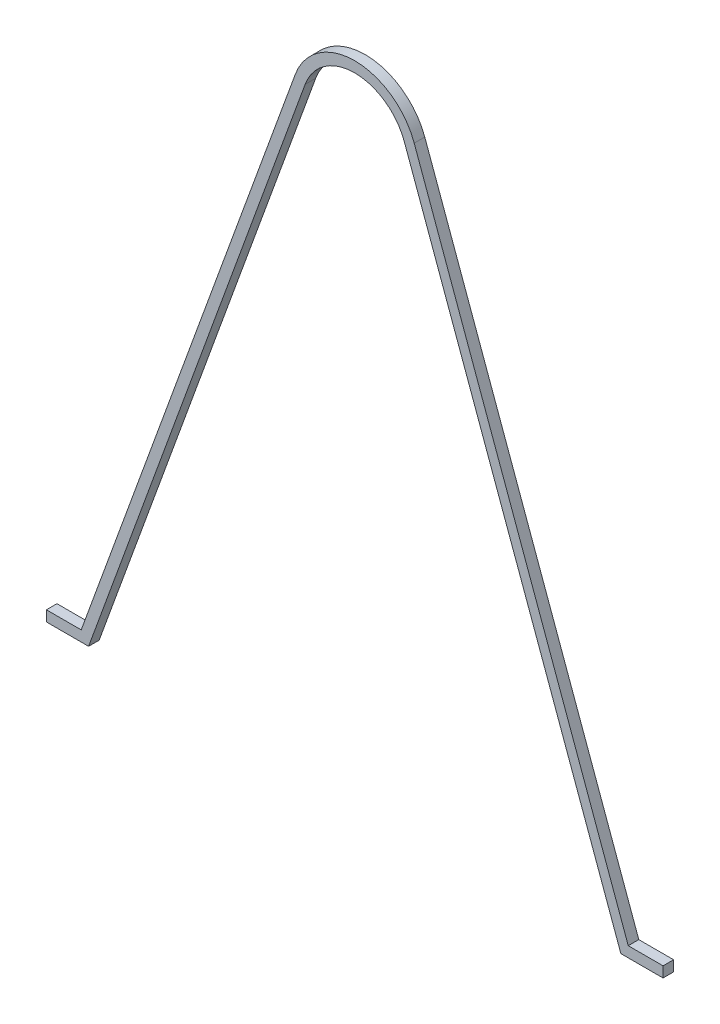
ISO-10303-21;
HEADER;
FILE_DESCRIPTION(('STEP AP214'),'2;1');
FILE_NAME('part.step','',(''),(''),'','','');
FILE_SCHEMA(('AUTOMOTIVE_DESIGN { 1 0 10303 214 1 1 1 1 }'));
ENDSEC;
DATA;
#1=APPLICATION_CONTEXT('core data for automotive mechanical design processes');
#2=APPLICATION_PROTOCOL_DEFINITION('international standard','automotive_design',2000,#1);
#3=PRODUCT_CONTEXT('',#1,'mechanical');
#4=PRODUCT('Part','Part','',(#3));
#5=PRODUCT_RELATED_PRODUCT_CATEGORY('part','',(#4));
#6=PRODUCT_DEFINITION_FORMATION('','',#4);
#7=PRODUCT_DEFINITION_CONTEXT('part definition',#1,'design');
#8=PRODUCT_DEFINITION('design','',#6,#7);
#9=PRODUCT_DEFINITION_SHAPE('','',#8);
#10=(LENGTH_UNIT() NAMED_UNIT(*) SI_UNIT(.MILLI.,.METRE.));
#11=(NAMED_UNIT(*) PLANE_ANGLE_UNIT() SI_UNIT($,.RADIAN.));
#12=(NAMED_UNIT(*) SI_UNIT($,.STERADIAN.) SOLID_ANGLE_UNIT());
#13=UNCERTAINTY_MEASURE_WITH_UNIT(LENGTH_MEASURE(1.E-05),#10,'distance_accuracy_value','');
#14=(GEOMETRIC_REPRESENTATION_CONTEXT(3) GLOBAL_UNCERTAINTY_ASSIGNED_CONTEXT((#13)) GLOBAL_UNIT_ASSIGNED_CONTEXT((#10,
#11,#12)) REPRESENTATION_CONTEXT('',''));
#15=CARTESIAN_POINT('',(0.,0.,0.));
#16=DIRECTION('',(0.,0.,1.));
#17=DIRECTION('',(1.,0.,0.));
#18=AXIS2_PLACEMENT_3D('',#15,#16,#17);
#19=CARTESIAN_POINT('',(-292.196717034695,-536.714565305262,10.));
#20=DIRECTION('',(1.,0.,0.));
#21=DIRECTION('',(0.,0.,-1.));
#22=AXIS2_PLACEMENT_3D('',#19,#20,#21);
#23=PLANE('',#22);
#24=DIRECTION('',(0.,-1.,0.));
#25=VECTOR('',#24,1.);
#26=CARTESIAN_POINT('',(-292.196717034695,-536.714565305262,0.));
#27=LINE('',#26,#25);
#28=CARTESIAN_POINT('',(-292.196717034695,-536.714565305262,0.));
#29=VERTEX_POINT('',#28);
#30=CARTESIAN_POINT('',(-292.196717034695,-546.714565305262,0.));
#31=VERTEX_POINT('',#30);
#32=EDGE_CURVE('E155',#29,#31,#27,.T.);
#33=ORIENTED_EDGE('',*,*,#32,.T.);
#34=DIRECTION('',(0.,0.,-1.));
#35=VECTOR('',#34,1.);
#36=CARTESIAN_POINT('',(-292.196717034695,-546.714565305262,10.));
#37=LINE('',#36,#35);
#38=CARTESIAN_POINT('',(-292.196717034695,-546.714565305262,10.));
#39=VERTEX_POINT('',#38);
#40=EDGE_CURVE('E11',#39,#31,#37,.T.);
#41=ORIENTED_EDGE('',*,*,#40,.F.);
#42=DIRECTION('',(0.,-1.,0.));
#43=VECTOR('',#42,1.);
#44=CARTESIAN_POINT('',(-292.196717034695,-536.714565305262,10.));
#45=LINE('',#44,#43);
#46=CARTESIAN_POINT('',(-292.196717034695,-536.714565305262,10.));
#47=VERTEX_POINT('',#46);
#48=EDGE_CURVE('E177',#47,#39,#45,.T.);
#49=ORIENTED_EDGE('',*,*,#48,.F.);
#50=DIRECTION('',(0.,0.,-1.));
#51=VECTOR('',#50,1.);
#52=CARTESIAN_POINT('',(-292.196717034695,-536.714565305262,10.));
#53=LINE('',#52,#51);
#54=EDGE_CURVE('E151',#47,#29,#53,.T.);
#55=ORIENTED_EDGE('',*,*,#54,.T.);
#56=EDGE_LOOP('',(#33,#41,#49,#55));
#57=FACE_BOUND('',#56,.T.);
#58=ADVANCED_FACE('F35',(#57),#23,.F.);
#59=CARTESIAN_POINT('',(-292.196717034695,-546.714565305262,10.));
#60=DIRECTION('',(0.,1.,0.));
#61=DIRECTION('',(-1.,0.,0.));
#62=AXIS2_PLACEMENT_3D('',#59,#60,#61);
#63=PLANE('',#62);
#64=DIRECTION('',(1.,0.,0.));
#65=VECTOR('',#64,1.);
#66=CARTESIAN_POINT('',(-292.196717034695,-546.714565305262,0.));
#67=LINE('',#66,#65);
#68=CARTESIAN_POINT('',(-252.196717034695,-546.714565305262,0.));
#69=VERTEX_POINT('',#68);
#70=EDGE_CURVE('E158',#31,#69,#67,.T.);
#71=ORIENTED_EDGE('',*,*,#70,.T.);
#72=DIRECTION('',(0.,0.,-1.));
#73=VECTOR('',#72,1.);
#74=CARTESIAN_POINT('',(-252.196717034695,-546.714565305262,10.));
#75=LINE('',#74,#73);
#76=CARTESIAN_POINT('',(-252.196717034695,-546.714565305262,10.));
#77=VERTEX_POINT('',#76);
#78=EDGE_CURVE('E43',#77,#69,#75,.T.);
#79=ORIENTED_EDGE('',*,*,#78,.F.);
#80=DIRECTION('',(1.,0.,0.));
#81=VECTOR('',#80,1.);
#82=CARTESIAN_POINT('',(-292.196717034695,-546.714565305262,10.));
#83=LINE('',#82,#81);
#84=EDGE_CURVE('E106',#39,#77,#83,.T.);
#85=ORIENTED_EDGE('',*,*,#84,.F.);
#86=ORIENTED_EDGE('',*,*,#40,.T.);
#87=EDGE_LOOP('',(#71,#79,#85,#86));
#88=FACE_BOUND('',#87,.T.);
#89=ADVANCED_FACE('F255',(#88),#63,.F.);
#90=CARTESIAN_POINT('',(-252.196717034695,-546.714565305262,10.));
#91=DIRECTION('',(-0.939692620785909,0.342020143325666,0.));
#92=DIRECTION('',(-0.342020143325666,-0.93969262078591,0.));
#93=AXIS2_PLACEMENT_3D('',#90,#91,#92);
#94=PLANE('',#93);
#95=DIRECTION('',(0.342020143325666,0.939692620785909,0.));
#96=VECTOR('',#95,1.);
#97=CARTESIAN_POINT('',(-252.196717034695,-546.714565305262,0.));
#98=LINE('',#97,#96);
#99=CARTESIAN_POINT('',(-46.9846310392954,17.1010071662833,0.));
#100=VERTEX_POINT('',#99);
#101=EDGE_CURVE('E160',#69,#100,#98,.T.);
#102=ORIENTED_EDGE('',*,*,#101,.T.);
#103=DIRECTION('',(0.,0.,-1.));
#104=VECTOR('',#103,1.);
#105=CARTESIAN_POINT('',(-46.9846310392954,17.1010071662833,10.));
#106=LINE('',#105,#104);
#107=CARTESIAN_POINT('',(-46.9846310392954,17.1010071662833,10.));
#108=VERTEX_POINT('',#107);
#109=EDGE_CURVE('E196',#108,#100,#106,.T.);
#110=ORIENTED_EDGE('',*,*,#109,.F.);
#111=DIRECTION('',(0.342020143325666,0.939692620785909,0.));
#112=VECTOR('',#111,1.);
#113=CARTESIAN_POINT('',(-252.196717034695,-546.714565305262,10.));
#114=LINE('',#113,#112);
#115=EDGE_CURVE('E204',#77,#108,#114,.T.);
#116=ORIENTED_EDGE('',*,*,#115,.F.);
#117=ORIENTED_EDGE('',*,*,#78,.T.);
#118=EDGE_LOOP('',(#102,#110,#116,#117));
#119=FACE_BOUND('',#118,.T.);
#120=ADVANCED_FACE('F202',(#119),#94,.F.);
#121=CARTESIAN_POINT('',(0.,0.,10.));
#122=DIRECTION('',(0.,0.,-1.));
#123=DIRECTION('',(-1.,0.,0.));
#124=AXIS2_PLACEMENT_3D('',#121,#122,#123);
#125=CYLINDRICAL_SURFACE('',#124,50.);
#126=CARTESIAN_POINT('',(0.,0.,0.));
#127=DIRECTION('',(0.,0.,-1.));
#128=DIRECTION('',(1.,0.,0.));
#129=AXIS2_PLACEMENT_3D('',#126,#127,#128);
#130=CIRCLE('',#129,50.);
#131=CARTESIAN_POINT('',(46.9846310392954,17.1010071662834,0.));
#132=VERTEX_POINT('',#131);
#133=EDGE_CURVE('E162',#100,#132,#130,.T.);
#134=ORIENTED_EDGE('',*,*,#133,.T.);
#135=DIRECTION('',(0.,0.,-1.));
#136=VECTOR('',#135,1.);
#137=CARTESIAN_POINT('',(46.9846310392954,17.1010071662834,10.));
#138=LINE('',#137,#136);
#139=CARTESIAN_POINT('',(46.9846310392954,17.1010071662834,10.));
#140=VERTEX_POINT('',#139);
#141=EDGE_CURVE('E193',#140,#132,#138,.T.);
#142=ORIENTED_EDGE('',*,*,#141,.F.);
#143=CARTESIAN_POINT('',(0.,0.,10.));
#144=DIRECTION('',(0.,0.,-1.));
#145=DIRECTION('',(1.,0.,0.));
#146=AXIS2_PLACEMENT_3D('',#143,#144,#145);
#147=CIRCLE('',#146,50.);
#148=EDGE_CURVE('E222',#108,#140,#147,.T.);
#149=ORIENTED_EDGE('',*,*,#148,.F.);
#150=ORIENTED_EDGE('',*,*,#109,.T.);
#151=EDGE_LOOP('',(#134,#142,#149,#150));
#152=FACE_BOUND('',#151,.T.);
#153=ADVANCED_FACE('F213',(#152),#125,.F.);
#154=CARTESIAN_POINT('',(252.196717034695,-546.714565305262,10.));
#155=DIRECTION('',(0.93969262078591,0.342020143325666,0.));
#156=DIRECTION('',(-0.342020143325666,0.93969262078591,0.));
#157=AXIS2_PLACEMENT_3D('',#154,#155,#156);
#158=PLANE('',#157);
#159=DIRECTION('',(0.342020143325666,-0.939692620785909,0.));
#160=VECTOR('',#159,1.);
#161=CARTESIAN_POINT('',(252.196717034695,-546.714565305262,0.));
#162=LINE('',#161,#160);
#163=CARTESIAN_POINT('',(252.196717034695,-546.714565305262,0.));
#164=VERTEX_POINT('',#163);
#165=EDGE_CURVE('E164',#132,#164,#162,.T.);
#166=ORIENTED_EDGE('',*,*,#165,.T.);
#167=DIRECTION('',(0.,0.,-1.));
#168=VECTOR('',#167,1.);
#169=CARTESIAN_POINT('',(252.196717034695,-546.714565305262,10.));
#170=LINE('',#169,#168);
#171=CARTESIAN_POINT('',(252.196717034695,-546.714565305262,10.));
#172=VERTEX_POINT('',#171);
#173=EDGE_CURVE('E190',#172,#164,#170,.T.);
#174=ORIENTED_EDGE('',*,*,#173,.F.);
#175=DIRECTION('',(0.342020143325666,-0.939692620785909,0.));
#176=VECTOR('',#175,1.);
#177=CARTESIAN_POINT('',(252.196717034695,-546.714565305262,10.));
#178=LINE('',#177,#176);
#179=EDGE_CURVE('E219',#140,#172,#178,.T.);
#180=ORIENTED_EDGE('',*,*,#179,.F.);
#181=ORIENTED_EDGE('',*,*,#141,.T.);
#182=EDGE_LOOP('',(#166,#174,#180,#181));
#183=FACE_BOUND('',#182,.T.);
#184=ADVANCED_FACE('F217',(#183),#158,.F.);
#185=CARTESIAN_POINT('',(292.196717034695,-546.714565305262,10.));
#186=DIRECTION('',(0.,1.,0.));
#187=DIRECTION('',(-1.,0.,0.));
#188=AXIS2_PLACEMENT_3D('',#185,#186,#187);
#189=PLANE('',#188);
#190=DIRECTION('',(1.,0.,0.));
#191=VECTOR('',#190,1.);
#192=CARTESIAN_POINT('',(292.196717034695,-546.714565305262,0.));
#193=LINE('',#192,#191);
#194=CARTESIAN_POINT('',(292.196717034695,-546.714565305262,0.));
#195=VERTEX_POINT('',#194);
#196=EDGE_CURVE('E166',#164,#195,#193,.T.);
#197=ORIENTED_EDGE('',*,*,#196,.T.);
#198=DIRECTION('',(0.,0.,-1.));
#199=VECTOR('',#198,1.);
#200=CARTESIAN_POINT('',(292.196717034695,-546.714565305262,10.));
#201=LINE('',#200,#199);
#202=CARTESIAN_POINT('',(292.196717034695,-546.714565305262,10.));
#203=VERTEX_POINT('',#202);
#204=EDGE_CURVE('E187',#203,#195,#201,.T.);
#205=ORIENTED_EDGE('',*,*,#204,.F.);
#206=DIRECTION('',(1.,0.,0.));
#207=VECTOR('',#206,1.);
#208=CARTESIAN_POINT('',(292.196717034695,-546.714565305262,10.));
#209=LINE('',#208,#207);
#210=EDGE_CURVE('E221',#172,#203,#209,.T.);
#211=ORIENTED_EDGE('',*,*,#210,.F.);
#212=ORIENTED_EDGE('',*,*,#173,.T.);
#213=EDGE_LOOP('',(#197,#205,#211,#212));
#214=FACE_BOUND('',#213,.T.);
#215=ADVANCED_FACE('F268',(#214),#189,.F.);
#216=CARTESIAN_POINT('',(292.196717034695,-536.714565305262,10.));
#217=DIRECTION('',(-1.,0.,0.));
#218=DIRECTION('',(0.,0.,1.));
#219=AXIS2_PLACEMENT_3D('',#216,#217,#218);
#220=PLANE('',#219);
#221=DIRECTION('',(0.,1.,0.));
#222=VECTOR('',#221,1.);
#223=CARTESIAN_POINT('',(292.196717034695,-536.714565305262,0.));
#224=LINE('',#223,#222);
#225=CARTESIAN_POINT('',(292.196717034695,-536.714565305262,0.));
#226=VERTEX_POINT('',#225);
#227=EDGE_CURVE('E168',#195,#226,#224,.T.);
#228=ORIENTED_EDGE('',*,*,#227,.T.);
#229=DIRECTION('',(0.,0.,-1.));
#230=VECTOR('',#229,1.);
#231=CARTESIAN_POINT('',(292.196717034695,-536.714565305262,10.));
#232=LINE('',#231,#230);
#233=CARTESIAN_POINT('',(292.196717034695,-536.714565305262,10.));
#234=VERTEX_POINT('',#233);
#235=EDGE_CURVE('E184',#234,#226,#232,.T.);
#236=ORIENTED_EDGE('',*,*,#235,.F.);
#237=DIRECTION('',(0.,1.,0.));
#238=VECTOR('',#237,1.);
#239=CARTESIAN_POINT('',(292.196717034695,-536.714565305262,10.));
#240=LINE('',#239,#238);
#241=EDGE_CURVE('E224',#203,#234,#240,.T.);
#242=ORIENTED_EDGE('',*,*,#241,.F.);
#243=ORIENTED_EDGE('',*,*,#204,.T.);
#244=EDGE_LOOP('',(#228,#236,#242,#243));
#245=FACE_BOUND('',#244,.T.);
#246=ADVANCED_FACE('F271',(#245),#220,.F.);
#247=CARTESIAN_POINT('',(292.196717034695,-536.714565305262,10.));
#248=DIRECTION('',(0.,-1.,0.));
#249=DIRECTION('',(0.,0.,-1.));
#250=AXIS2_PLACEMENT_3D('',#247,#248,#249);
#251=PLANE('',#250);
#252=DIRECTION('',(-1.,0.,0.));
#253=VECTOR('',#252,1.);
#254=CARTESIAN_POINT('',(292.196717034695,-536.714565305262,0.));
#255=LINE('',#254,#253);
#256=CARTESIAN_POINT('',(259.198792416792,-536.714565305262,0.));
#257=VERTEX_POINT('',#256);
#258=EDGE_CURVE('E170',#226,#257,#255,.T.);
#259=ORIENTED_EDGE('',*,*,#258,.T.);
#260=DIRECTION('',(0.,0.,-1.));
#261=VECTOR('',#260,1.);
#262=CARTESIAN_POINT('',(259.198792416792,-536.714565305262,10.));
#263=LINE('',#262,#261);
#264=CARTESIAN_POINT('',(259.198792416792,-536.714565305262,10.));
#265=VERTEX_POINT('',#264);
#266=EDGE_CURVE('E181',#265,#257,#263,.T.);
#267=ORIENTED_EDGE('',*,*,#266,.F.);
#268=DIRECTION('',(-1.,0.,0.));
#269=VECTOR('',#268,1.);
#270=CARTESIAN_POINT('',(292.196717034695,-536.714565305262,10.));
#271=LINE('',#270,#269);
#272=EDGE_CURVE('E230',#234,#265,#271,.T.);
#273=ORIENTED_EDGE('',*,*,#272,.F.);
#274=ORIENTED_EDGE('',*,*,#235,.T.);
#275=EDGE_LOOP('',(#259,#267,#273,#274));
#276=FACE_BOUND('',#275,.T.);
#277=ADVANCED_FACE('F236',(#276),#251,.F.);
#278=CARTESIAN_POINT('',(259.198792416792,-536.714565305262,10.));
#279=DIRECTION('',(-0.93969262078591,-0.342020143325666,0.));
#280=DIRECTION('',(0.342020143325666,-0.93969262078591,0.));
#281=AXIS2_PLACEMENT_3D('',#278,#279,#280);
#282=PLANE('',#281);
#283=DIRECTION('',(-0.342020143325666,0.939692620785909,0.));
#284=VECTOR('',#283,1.);
#285=CARTESIAN_POINT('',(259.198792416792,-536.714565305262,0.));
#286=LINE('',#285,#284);
#287=CARTESIAN_POINT('',(56.3815572471546,20.52120859954,0.));
#288=VERTEX_POINT('',#287);
#289=EDGE_CURVE('E172',#257,#288,#286,.T.);
#290=ORIENTED_EDGE('',*,*,#289,.T.);
#291=DIRECTION('',(0.,0.,-1.));
#292=VECTOR('',#291,1.);
#293=CARTESIAN_POINT('',(56.3815572471546,20.52120859954,10.));
#294=LINE('',#293,#292);
#295=CARTESIAN_POINT('',(56.3815572471546,20.52120859954,10.));
#296=VERTEX_POINT('',#295);
#297=EDGE_CURVE('E146',#296,#288,#294,.T.);
#298=ORIENTED_EDGE('',*,*,#297,.F.);
#299=DIRECTION('',(-0.342020143325666,0.939692620785909,0.));
#300=VECTOR('',#299,1.);
#301=CARTESIAN_POINT('',(259.198792416792,-536.714565305262,10.));
#302=LINE('',#301,#300);
#303=EDGE_CURVE('E137',#265,#296,#302,.T.);
#304=ORIENTED_EDGE('',*,*,#303,.F.);
#305=ORIENTED_EDGE('',*,*,#266,.T.);
#306=EDGE_LOOP('',(#290,#298,#304,#305));
#307=FACE_BOUND('',#306,.T.);
#308=ADVANCED_FACE('F240',(#307),#282,.F.);
#309=CARTESIAN_POINT('',(0.,0.,10.));
#310=DIRECTION('',(0.,0.,-1.));
#311=DIRECTION('',(-1.,0.,0.));
#312=AXIS2_PLACEMENT_3D('',#309,#310,#311);
#313=CYLINDRICAL_SURFACE('',#312,60.);
#314=CARTESIAN_POINT('',(0.,0.,0.));
#315=DIRECTION('',(0.,0.,1.));
#316=DIRECTION('',(1.,0.,0.));
#317=AXIS2_PLACEMENT_3D('',#314,#315,#316);
#318=CIRCLE('',#317,60.);
#319=CARTESIAN_POINT('',(-56.3815572471546,20.52120859954,0.));
#320=VERTEX_POINT('',#319);
#321=EDGE_CURVE('E145',#288,#320,#318,.T.);
#322=ORIENTED_EDGE('',*,*,#321,.T.);
#323=DIRECTION('',(0.,0.,-1.));
#324=VECTOR('',#323,1.);
#325=CARTESIAN_POINT('',(-56.3815572471546,20.52120859954,10.));
#326=LINE('',#325,#324);
#327=CARTESIAN_POINT('',(-56.3815572471546,20.52120859954,10.));
#328=VERTEX_POINT('',#327);
#329=EDGE_CURVE('E142',#328,#320,#326,.T.);
#330=ORIENTED_EDGE('',*,*,#329,.F.);
#331=CARTESIAN_POINT('',(0.,0.,10.));
#332=DIRECTION('',(0.,0.,1.));
#333=DIRECTION('',(1.,0.,0.));
#334=AXIS2_PLACEMENT_3D('',#331,#332,#333);
#335=CIRCLE('',#334,60.);
#336=EDGE_CURVE('E131',#296,#328,#335,.T.);
#337=ORIENTED_EDGE('',*,*,#336,.F.);
#338=ORIENTED_EDGE('',*,*,#297,.T.);
#339=EDGE_LOOP('',(#322,#330,#337,#338));
#340=FACE_BOUND('',#339,.T.);
#341=ADVANCED_FACE('F143',(#340),#313,.T.);
#342=CARTESIAN_POINT('',(-259.198792416792,-536.714565305262,10.));
#343=DIRECTION('',(0.939692620785909,-0.342020143325666,0.));
#344=DIRECTION('',(0.342020143325666,0.939692620785909,0.));
#345=AXIS2_PLACEMENT_3D('',#342,#343,#344);
#346=PLANE('',#345);
#347=DIRECTION('',(-0.342020143325666,-0.939692620785909,0.));
#348=VECTOR('',#347,1.);
#349=CARTESIAN_POINT('',(-259.198792416792,-536.714565305262,0.));
#350=LINE('',#349,#348);
#351=CARTESIAN_POINT('',(-259.198792416792,-536.714565305262,0.));
#352=VERTEX_POINT('',#351);
#353=EDGE_CURVE('E92',#320,#352,#350,.T.);
#354=ORIENTED_EDGE('',*,*,#353,.T.);
#355=DIRECTION('',(0.,0.,-1.));
#356=VECTOR('',#355,1.);
#357=CARTESIAN_POINT('',(-259.198792416792,-536.714565305262,10.));
#358=LINE('',#357,#356);
#359=CARTESIAN_POINT('',(-259.198792416792,-536.714565305262,10.));
#360=VERTEX_POINT('',#359);
#361=EDGE_CURVE('E147',#360,#352,#358,.T.);
#362=ORIENTED_EDGE('',*,*,#361,.F.);
#363=DIRECTION('',(-0.342020143325666,-0.939692620785909,0.));
#364=VECTOR('',#363,1.);
#365=CARTESIAN_POINT('',(-259.198792416792,-536.714565305262,10.));
#366=LINE('',#365,#364);
#367=EDGE_CURVE('E135',#328,#360,#366,.T.);
#368=ORIENTED_EDGE('',*,*,#367,.F.);
#369=ORIENTED_EDGE('',*,*,#329,.T.);
#370=EDGE_LOOP('',(#354,#362,#368,#369));
#371=FACE_BOUND('',#370,.T.);
#372=ADVANCED_FACE('F149',(#371),#346,.F.);
#373=CARTESIAN_POINT('',(-292.196717034695,-536.714565305262,10.));
#374=DIRECTION('',(0.,-1.,0.));
#375=DIRECTION('',(0.,0.,-1.));
#376=AXIS2_PLACEMENT_3D('',#373,#374,#375);
#377=PLANE('',#376);
#378=DIRECTION('',(-1.,0.,0.));
#379=VECTOR('',#378,1.);
#380=CARTESIAN_POINT('',(-292.196717034695,-536.714565305262,0.));
#381=LINE('',#380,#379);
#382=EDGE_CURVE('E98',#352,#29,#381,.T.);
#383=ORIENTED_EDGE('',*,*,#382,.T.);
#384=ORIENTED_EDGE('',*,*,#54,.F.);
#385=DIRECTION('',(-1.,0.,0.));
#386=VECTOR('',#385,1.);
#387=CARTESIAN_POINT('',(-292.196717034695,-536.714565305262,10.));
#388=LINE('',#387,#386);
#389=EDGE_CURVE('E51',#360,#47,#388,.T.);
#390=ORIENTED_EDGE('',*,*,#389,.F.);
#391=ORIENTED_EDGE('',*,*,#361,.T.);
#392=EDGE_LOOP('',(#383,#384,#390,#391));
#393=FACE_BOUND('',#392,.T.);
#394=ADVANCED_FACE('F244',(#393),#377,.F.);
#395=CARTESIAN_POINT('',(0.,0.,10.));
#396=DIRECTION('',(0.,0.,1.));
#397=DIRECTION('',(1.,0.,0.));
#398=AXIS2_PLACEMENT_3D('',#395,#396,#397);
#399=PLANE('',#398);
#400=ORIENTED_EDGE('',*,*,#48,.T.);
#401=ORIENTED_EDGE('',*,*,#84,.T.);
#402=ORIENTED_EDGE('',*,*,#115,.T.);
#403=ORIENTED_EDGE('',*,*,#148,.T.);
#404=ORIENTED_EDGE('',*,*,#179,.T.);
#405=ORIENTED_EDGE('',*,*,#210,.T.);
#406=ORIENTED_EDGE('',*,*,#241,.T.);
#407=ORIENTED_EDGE('',*,*,#272,.T.);
#408=ORIENTED_EDGE('',*,*,#303,.T.);
#409=ORIENTED_EDGE('',*,*,#336,.T.);
#410=ORIENTED_EDGE('',*,*,#367,.T.);
#411=ORIENTED_EDGE('',*,*,#389,.T.);
#412=EDGE_LOOP('',(#400,#401,#402,#403,#404,#405,#406,#407,#408,#409,#410,#411));
#413=FACE_BOUND('',#412,.T.);
#414=ADVANCED_FACE('F133',(#413),#399,.T.);
#415=CARTESIAN_POINT('',(0.,0.,0.));
#416=DIRECTION('',(0.,0.,1.));
#417=DIRECTION('',(1.,0.,0.));
#418=AXIS2_PLACEMENT_3D('',#415,#416,#417);
#419=PLANE('',#418);
#420=ORIENTED_EDGE('',*,*,#32,.F.);
#421=ORIENTED_EDGE('',*,*,#382,.F.);
#422=ORIENTED_EDGE('',*,*,#353,.F.);
#423=ORIENTED_EDGE('',*,*,#321,.F.);
#424=ORIENTED_EDGE('',*,*,#289,.F.);
#425=ORIENTED_EDGE('',*,*,#258,.F.);
#426=ORIENTED_EDGE('',*,*,#227,.F.);
#427=ORIENTED_EDGE('',*,*,#196,.F.);
#428=ORIENTED_EDGE('',*,*,#165,.F.);
#429=ORIENTED_EDGE('',*,*,#133,.F.);
#430=ORIENTED_EDGE('',*,*,#101,.F.);
#431=ORIENTED_EDGE('',*,*,#70,.F.);
#432=EDGE_LOOP('',(#420,#421,#422,#423,#424,#425,#426,#427,#428,#429,#430,#431));
#433=FACE_BOUND('',#432,.T.);
#434=ADVANCED_FACE('F208',(#433),#419,.F.);
#435=CLOSED_SHELL('',(#58,#89,#120,#153,#184,#215,#246,#277,#308,#341,#372,#394,#414,#434));
#436=MANIFOLD_SOLID_BREP('B2',#435);
#437=ADVANCED_BREP_SHAPE_REPRESENTATION('',(#18,#436),#14);
#438=SHAPE_DEFINITION_REPRESENTATION(#9,#437);
ENDSEC;
END-ISO-10303-21;
